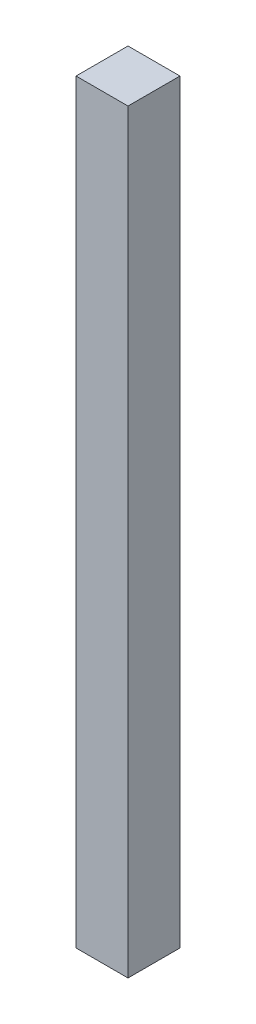
ISO-10303-21;
HEADER;
FILE_DESCRIPTION(('STEP AP214'),'2;1');
FILE_NAME('part.step','',(''),(''),'','','');
FILE_SCHEMA(('AUTOMOTIVE_DESIGN { 1 0 10303 214 1 1 1 1 }'));
ENDSEC;
DATA;
#1=APPLICATION_CONTEXT('core data for automotive mechanical design processes');
#2=APPLICATION_PROTOCOL_DEFINITION('international standard','automotive_design',2000,#1);
#3=PRODUCT_CONTEXT('',#1,'mechanical');
#4=PRODUCT('Part','Part','',(#3));
#5=PRODUCT_RELATED_PRODUCT_CATEGORY('part','',(#4));
#6=PRODUCT_DEFINITION_FORMATION('','',#4);
#7=PRODUCT_DEFINITION_CONTEXT('part definition',#1,'design');
#8=PRODUCT_DEFINITION('design','',#6,#7);
#9=PRODUCT_DEFINITION_SHAPE('','',#8);
#10=(LENGTH_UNIT() NAMED_UNIT(*) SI_UNIT(.MILLI.,.METRE.));
#11=(NAMED_UNIT(*) PLANE_ANGLE_UNIT() SI_UNIT($,.RADIAN.));
#12=(NAMED_UNIT(*) SI_UNIT($,.STERADIAN.) SOLID_ANGLE_UNIT());
#13=UNCERTAINTY_MEASURE_WITH_UNIT(LENGTH_MEASURE(1.E-05),#10,'distance_accuracy_value','');
#14=(GEOMETRIC_REPRESENTATION_CONTEXT(3) GLOBAL_UNCERTAINTY_ASSIGNED_CONTEXT((#13)) GLOBAL_UNIT_ASSIGNED_CONTEXT((#10,
#11,#12)) REPRESENTATION_CONTEXT('',''));
#15=CARTESIAN_POINT('',(0.,0.,0.));
#16=DIRECTION('',(0.,0.,1.));
#17=DIRECTION('',(1.,0.,0.));
#18=AXIS2_PLACEMENT_3D('',#15,#16,#17);
#19=CARTESIAN_POINT('',(0.,318.844721854999,0.));
#20=DIRECTION('',(1.,0.,0.));
#21=DIRECTION('',(0.,0.,-1.));
#22=AXIS2_PLACEMENT_3D('',#19,#20,#21);
#23=PLANE('',#22);
#24=DIRECTION('',(0.,0.,1.));
#25=VECTOR('',#24,1.);
#26=CARTESIAN_POINT('',(0.,290.560450607537,0.));
#27=LINE('',#26,#25);
#28=CARTESIAN_POINT('',(0.,290.560450607537,0.));
#29=VERTEX_POINT('',#28);
#30=CARTESIAN_POINT('',(0.,290.560450607537,20.));
#31=VERTEX_POINT('',#30);
#32=EDGE_CURVE('E41',#29,#31,#27,.T.);
#33=ORIENTED_EDGE('',*,*,#32,.F.);
#34=DIRECTION('',(0.,-1.,0.));
#35=VECTOR('',#34,1.);
#36=CARTESIAN_POINT('',(0.,318.844721854999,0.));
#37=LINE('',#36,#35);
#38=CARTESIAN_POINT('',(0.,0.,0.));
#39=VERTEX_POINT('',#38);
#40=EDGE_CURVE('E90',#29,#39,#37,.T.);
#41=ORIENTED_EDGE('',*,*,#40,.T.);
#42=DIRECTION('',(0.,0.,1.));
#43=VECTOR('',#42,1.);
#44=CARTESIAN_POINT('',(0.,0.,0.));
#45=LINE('',#44,#43);
#46=CARTESIAN_POINT('',(0.,0.,20.));
#47=VERTEX_POINT('',#46);
#48=EDGE_CURVE('E85',#39,#47,#45,.T.);
#49=ORIENTED_EDGE('',*,*,#48,.T.);
#50=DIRECTION('',(0.,-1.,0.));
#51=VECTOR('',#50,1.);
#52=CARTESIAN_POINT('',(0.,318.844721854999,20.));
#53=LINE('',#52,#51);
#54=EDGE_CURVE('E70',#31,#47,#53,.T.);
#55=ORIENTED_EDGE('',*,*,#54,.F.);
#56=EDGE_LOOP('',(#33,#41,#49,#55));
#57=FACE_BOUND('',#56,.T.);
#58=ADVANCED_FACE('F33',(#57),#23,.F.);
#59=CARTESIAN_POINT('',(0.,318.844721854999,20.));
#60=DIRECTION('',(0.,0.,-1.));
#61=DIRECTION('',(-1.,0.,0.));
#62=AXIS2_PLACEMENT_3D('',#59,#60,#61);
#63=PLANE('',#62);
#64=DIRECTION('',(1.,0.,0.));
#65=VECTOR('',#64,1.);
#66=CARTESIAN_POINT('',(0.,290.560450607537,20.));
#67=LINE('',#66,#65);
#68=CARTESIAN_POINT('',(20.0000000000002,290.560450607537,20.));
#69=VERTEX_POINT('',#68);
#70=EDGE_CURVE('E36',#31,#69,#67,.T.);
#71=ORIENTED_EDGE('',*,*,#70,.F.);
#72=ORIENTED_EDGE('',*,*,#54,.T.);
#73=DIRECTION('',(1.,0.,0.));
#74=VECTOR('',#73,1.);
#75=CARTESIAN_POINT('',(0.,0.,20.));
#76=LINE('',#75,#74);
#77=CARTESIAN_POINT('',(20.,0.,20.));
#78=VERTEX_POINT('',#77);
#79=EDGE_CURVE('E74',#47,#78,#76,.T.);
#80=ORIENTED_EDGE('',*,*,#79,.T.);
#81=DIRECTION('',(0.,-1.,0.));
#82=VECTOR('',#81,1.);
#83=CARTESIAN_POINT('',(20.,318.844721854999,20.));
#84=LINE('',#83,#82);
#85=EDGE_CURVE('E79',#69,#78,#84,.T.);
#86=ORIENTED_EDGE('',*,*,#85,.F.);
#87=EDGE_LOOP('',(#71,#72,#80,#86));
#88=FACE_BOUND('',#87,.T.);
#89=ADVANCED_FACE('F72',(#88),#63,.F.);
#90=CARTESIAN_POINT('',(20.,318.844721854999,0.));
#91=DIRECTION('',(-1.,0.,0.));
#92=DIRECTION('',(0.,0.,1.));
#93=AXIS2_PLACEMENT_3D('',#90,#91,#92);
#94=PLANE('',#93);
#95=DIRECTION('',(0.,0.,-1.));
#96=VECTOR('',#95,1.);
#97=CARTESIAN_POINT('',(20.,290.560450607537,0.));
#98=LINE('',#97,#96);
#99=CARTESIAN_POINT('',(20.,290.560450607537,0.));
#100=VERTEX_POINT('',#99);
#101=EDGE_CURVE('E78',#69,#100,#98,.T.);
#102=ORIENTED_EDGE('',*,*,#101,.F.);
#103=ORIENTED_EDGE('',*,*,#85,.T.);
#104=DIRECTION('',(0.,0.,-1.));
#105=VECTOR('',#104,1.);
#106=CARTESIAN_POINT('',(20.,0.,0.));
#107=LINE('',#106,#105);
#108=CARTESIAN_POINT('',(20.,0.,0.));
#109=VERTEX_POINT('',#108);
#110=EDGE_CURVE('E87',#78,#109,#107,.T.);
#111=ORIENTED_EDGE('',*,*,#110,.T.);
#112=DIRECTION('',(0.,-1.,0.));
#113=VECTOR('',#112,1.);
#114=CARTESIAN_POINT('',(20.,318.844721854999,0.));
#115=LINE('',#114,#113);
#116=EDGE_CURVE('E99',#100,#109,#115,.T.);
#117=ORIENTED_EDGE('',*,*,#116,.F.);
#118=EDGE_LOOP('',(#102,#103,#111,#117));
#119=FACE_BOUND('',#118,.T.);
#120=ADVANCED_FACE('F105',(#119),#94,.F.);
#121=CARTESIAN_POINT('',(0.,318.844721854999,0.));
#122=DIRECTION('',(0.,0.,1.));
#123=DIRECTION('',(1.,0.,0.));
#124=AXIS2_PLACEMENT_3D('',#121,#122,#123);
#125=PLANE('',#124);
#126=DIRECTION('',(-1.,0.,0.));
#127=VECTOR('',#126,1.);
#128=CARTESIAN_POINT('',(0.,290.560450607537,0.));
#129=LINE('',#128,#127);
#130=EDGE_CURVE('E11',#100,#29,#129,.T.);
#131=ORIENTED_EDGE('',*,*,#130,.F.);
#132=ORIENTED_EDGE('',*,*,#116,.T.);
#133=DIRECTION('',(-1.,0.,0.));
#134=VECTOR('',#133,1.);
#135=CARTESIAN_POINT('',(0.,0.,0.));
#136=LINE('',#135,#134);
#137=EDGE_CURVE('E96',#109,#39,#136,.T.);
#138=ORIENTED_EDGE('',*,*,#137,.T.);
#139=ORIENTED_EDGE('',*,*,#40,.F.);
#140=EDGE_LOOP('',(#131,#132,#138,#139));
#141=FACE_BOUND('',#140,.T.);
#142=ADVANCED_FACE('F107',(#141),#125,.F.);
#143=CARTESIAN_POINT('',(0.,0.,0.));
#144=DIRECTION('',(0.,1.,0.));
#145=DIRECTION('',(0.,0.,1.));
#146=AXIS2_PLACEMENT_3D('',#143,#144,#145);
#147=PLANE('',#146);
#148=ORIENTED_EDGE('',*,*,#48,.F.);
#149=ORIENTED_EDGE('',*,*,#137,.F.);
#150=ORIENTED_EDGE('',*,*,#110,.F.);
#151=ORIENTED_EDGE('',*,*,#79,.F.);
#152=EDGE_LOOP('',(#148,#149,#150,#151));
#153=FACE_BOUND('',#152,.T.);
#154=ADVANCED_FACE('F83',(#153),#147,.F.);
#155=CARTESIAN_POINT('',(-0.299999999999967,290.560450607537,53.3306878685359));
#156=DIRECTION('',(0.,1.,0.));
#157=DIRECTION('',(-1.,0.,0.));
#158=AXIS2_PLACEMENT_3D('',#155,#156,#157);
#159=PLANE('',#158);
#160=ORIENTED_EDGE('',*,*,#32,.T.);
#161=ORIENTED_EDGE('',*,*,#70,.T.);
#162=ORIENTED_EDGE('',*,*,#101,.T.);
#163=ORIENTED_EDGE('',*,*,#130,.T.);
#164=EDGE_LOOP('',(#160,#161,#162,#163));
#165=FACE_BOUND('',#164,.T.);
#166=ADVANCED_FACE('F102',(#165),#159,.T.);
#167=CLOSED_SHELL('',(#58,#89,#120,#142,#154,#166));
#168=MANIFOLD_SOLID_BREP('B2',#167);
#169=ADVANCED_BREP_SHAPE_REPRESENTATION('',(#18,#168),#14);
#170=SHAPE_DEFINITION_REPRESENTATION(#9,#169);
ENDSEC;
END-ISO-10303-21;
